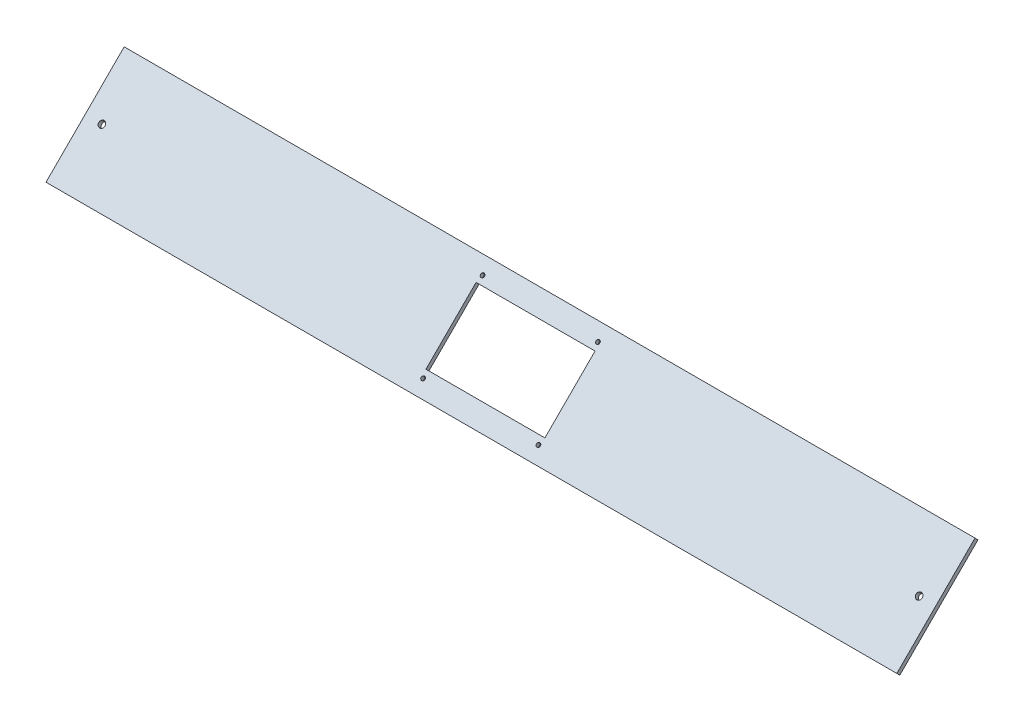
ISO-10303-21;
HEADER;
FILE_DESCRIPTION(('STEP AP214'),'2;1');
FILE_NAME('part.step','',(''),(''),'','','');
FILE_SCHEMA(('AUTOMOTIVE_DESIGN { 1 0 10303 214 1 1 1 1 }'));
ENDSEC;
DATA;
#1=APPLICATION_CONTEXT('core data for automotive mechanical design processes');
#2=APPLICATION_PROTOCOL_DEFINITION('international standard','automotive_design',2000,#1);
#3=PRODUCT_CONTEXT('',#1,'mechanical');
#4=PRODUCT('Part','Part','',(#3));
#5=PRODUCT_RELATED_PRODUCT_CATEGORY('part','',(#4));
#6=PRODUCT_DEFINITION_FORMATION('','',#4);
#7=PRODUCT_DEFINITION_CONTEXT('part definition',#1,'design');
#8=PRODUCT_DEFINITION('design','',#6,#7);
#9=PRODUCT_DEFINITION_SHAPE('','',#8);
#10=(LENGTH_UNIT() NAMED_UNIT(*) SI_UNIT(.MILLI.,.METRE.));
#11=(NAMED_UNIT(*) PLANE_ANGLE_UNIT() SI_UNIT($,.RADIAN.));
#12=(NAMED_UNIT(*) SI_UNIT($,.STERADIAN.) SOLID_ANGLE_UNIT());
#13=UNCERTAINTY_MEASURE_WITH_UNIT(LENGTH_MEASURE(1.E-05),#10,'distance_accuracy_value','');
#14=(GEOMETRIC_REPRESENTATION_CONTEXT(3) GLOBAL_UNCERTAINTY_ASSIGNED_CONTEXT((#13)) GLOBAL_UNIT_ASSIGNED_CONTEXT((#10,
#11,#12)) REPRESENTATION_CONTEXT('',''));
#15=CARTESIAN_POINT('',(0.,0.,0.));
#16=DIRECTION('',(0.,0.,1.));
#17=DIRECTION('',(1.,0.,0.));
#18=AXIS2_PLACEMENT_3D('',#15,#16,#17);
#19=CARTESIAN_POINT('',(306.,-385.882863738547,-560.380338421605));
#20=DIRECTION('',(0.,0.707106781186548,0.707106781186547));
#21=DIRECTION('',(0.,-0.707106781186547,0.707106781186548));
#22=AXIS2_PLACEMENT_3D('',#19,#20,#21);
#23=CYLINDRICAL_SURFACE('',#22,1.59999999999996);
#24=CARTESIAN_POINT('',(306.,112.248737341529,-62.2487373415291));
#25=DIRECTION('',(0.,0.707106781186549,0.707106781186546));
#26=DIRECTION('',(0.,-0.707106781186546,0.707106781186549));
#27=AXIS2_PLACEMENT_3D('',#24,#25,#26);
#28=CIRCLE('',#27,1.59999999999996);
#29=CARTESIAN_POINT('',(306.,111.117366491631,-61.1173664916306));
#30=VERTEX_POINT('',#29);
#31=EDGE_CURVE('E170',#30,#30,#28,.T.);
#32=CARTESIAN_POINT('',(306.,114.748737341529,-59.7487373415292));
#33=DIRECTION('',(0.,-0.707106781186548,-0.707106781186547));
#34=DIRECTION('',(0.,0.707106781186547,-0.707106781186548));
#35=AXIS2_PLACEMENT_3D('',#32,#33,#34);
#36=CIRCLE('',#35,1.59999999999996);
#37=CARTESIAN_POINT('',(306.,113.617366491631,-58.6173664916306));
#38=VERTEX_POINT('',#37);
#39=EDGE_CURVE('E207',#38,#38,#36,.T.);
#40=CARTESIAN_POINT('',(306.,111.117366491631,-61.1173664916306));
#41=CARTESIAN_POINT('',(306.,111.143408158297,-61.0913248249639));
#42=CARTESIAN_POINT('',(306.,111.169449824964,-61.0652831582973));
#43=CARTESIAN_POINT('',(306.,111.221533158297,-61.0131998249639));
#44=CARTESIAN_POINT('',(306.,111.247574824964,-60.9871581582973));
#45=CARTESIAN_POINT('',(306.,111.299658158297,-60.9350748249639));
#46=CARTESIAN_POINT('',(306.,111.325699824964,-60.9090331582973));
#47=CARTESIAN_POINT('',(306.,111.377783158297,-60.856949824964));
#48=CARTESIAN_POINT('',(306.,111.403824824964,-60.8309081582973));
#49=CARTESIAN_POINT('',(306.,111.455908158297,-60.778824824964));
#50=CARTESIAN_POINT('',(306.,111.481949824964,-60.7527831582973));
#51=CARTESIAN_POINT('',(306.,111.534033158297,-60.7006998249639));
#52=CARTESIAN_POINT('',(306.,111.560074824964,-60.6746581582973));
#53=CARTESIAN_POINT('',(306.,111.612158158297,-60.6225748249639));
#54=CARTESIAN_POINT('',(306.,111.638199824964,-60.5965331582973));
#55=CARTESIAN_POINT('',(306.,111.690283158297,-60.544449824964));
#56=CARTESIAN_POINT('',(306.,111.716324824964,-60.5184081582973));
#57=CARTESIAN_POINT('',(306.,111.768408158297,-60.466324824964));
#58=CARTESIAN_POINT('',(306.,111.794449824964,-60.4402831582973));
#59=CARTESIAN_POINT('',(306.,111.846533158297,-60.3881998249639));
#60=CARTESIAN_POINT('',(306.,111.872574824964,-60.3621581582973));
#61=CARTESIAN_POINT('',(306.,111.924658158297,-60.310074824964));
#62=CARTESIAN_POINT('',(306.,111.950699824964,-60.2840331582973));
#63=CARTESIAN_POINT('',(306.,112.002783158297,-60.2319498249639));
#64=CARTESIAN_POINT('',(306.,112.028824824964,-60.2059081582973));
#65=CARTESIAN_POINT('',(306.,112.080908158297,-60.1538248249639));
#66=CARTESIAN_POINT('',(306.,112.106949824964,-60.1277831582973));
#67=CARTESIAN_POINT('',(306.,112.159033158297,-60.0756998249639));
#68=CARTESIAN_POINT('',(306.,112.185074824964,-60.0496581582973));
#69=CARTESIAN_POINT('',(306.,112.237158158297,-59.997574824964));
#70=CARTESIAN_POINT('',(306.,112.263199824964,-59.9715331582973));
#71=CARTESIAN_POINT('',(306.,112.315283158297,-59.919449824964));
#72=CARTESIAN_POINT('',(306.,112.341324824964,-59.8934081582973));
#73=CARTESIAN_POINT('',(306.,112.393408158297,-59.841324824964));
#74=CARTESIAN_POINT('',(306.,112.419449824964,-59.8152831582973));
#75=CARTESIAN_POINT('',(306.,112.471533158297,-59.763199824964));
#76=CARTESIAN_POINT('',(306.,112.497574824964,-59.7371581582973));
#77=CARTESIAN_POINT('',(306.,112.549658158297,-59.685074824964));
#78=CARTESIAN_POINT('',(306.,112.575699824964,-59.6590331582973));
#79=CARTESIAN_POINT('',(306.,112.627783158297,-59.606949824964));
#80=CARTESIAN_POINT('',(306.,112.653824824964,-59.5809081582973));
#81=CARTESIAN_POINT('',(306.,112.705908158297,-59.528824824964));
#82=CARTESIAN_POINT('',(306.,112.731949824964,-59.5027831582973));
#83=CARTESIAN_POINT('',(306.,112.784033158297,-59.450699824964));
#84=CARTESIAN_POINT('',(306.,112.810074824964,-59.4246581582973));
#85=CARTESIAN_POINT('',(306.,112.862158158297,-59.372574824964));
#86=CARTESIAN_POINT('',(306.,112.888199824964,-59.3465331582973));
#87=CARTESIAN_POINT('',(306.,112.940283158297,-59.294449824964));
#88=CARTESIAN_POINT('',(306.,112.966324824964,-59.2684081582973));
#89=CARTESIAN_POINT('',(306.,113.018408158297,-59.216324824964));
#90=CARTESIAN_POINT('',(306.,113.044449824964,-59.1902831582973));
#91=CARTESIAN_POINT('',(306.,113.096533158297,-59.138199824964));
#92=CARTESIAN_POINT('',(306.,113.122574824964,-59.1121581582973));
#93=CARTESIAN_POINT('',(306.,113.174658158297,-59.060074824964));
#94=CARTESIAN_POINT('',(306.,113.200699824964,-59.0340331582974));
#95=CARTESIAN_POINT('',(306.,113.252783158297,-58.981949824964));
#96=CARTESIAN_POINT('',(306.,113.278824824964,-58.9559081582973));
#97=CARTESIAN_POINT('',(306.,113.330908158297,-58.9038248249639));
#98=CARTESIAN_POINT('',(306.,113.356949824964,-58.8777831582973));
#99=CARTESIAN_POINT('',(306.,113.409033158297,-58.825699824964));
#100=CARTESIAN_POINT('',(306.,113.435074824964,-58.7996581582973));
#101=CARTESIAN_POINT('',(306.,113.487158158297,-58.7475748249639));
#102=CARTESIAN_POINT('',(306.,113.513199824964,-58.7215331582973));
#103=CARTESIAN_POINT('',(306.,113.565283158297,-58.669449824964));
#104=CARTESIAN_POINT('',(306.,113.591324824964,-58.6434081582974));
#105=CARTESIAN_POINT('',(306.,113.617366491631,-58.6173664916306));
#106=B_SPLINE_CURVE_WITH_KNOTS('',3,(#40,#41,#42,#43,#44,#45,#46,#47,#48,#49,#50,#51,#52,#53,
#54,#55,#56,#57,#58,#59,#60,#61,#62,#63,#64,#65,#66,#67,#68,#69,#70,#71,#72,#73,#74,#75,#76,#77,
#78,#79,#80,#81,#82,#83,#84,#85,#86,#87,#88,#89,#90,#91,#92,#93,#94,#95,#96,#97,#98,#99,#100,
#101,#102,#103,#104,#105),.UNSPECIFIED.,.F.,.F.,(4,2,2,2,2,2,2,2,2,2,2,2,2,2,2,2,2,2,2,2,2,2,2,
2,2,2,2,2,2,2,2,2,4),(0.,0.110485434560376,0.220970869120752,0.331456303681168,
0.441941738241544,0.552427172801998,0.662912607362374,0.77339804192275,0.883883476483126,
0.994368911043542,1.10485434560392,1.21533978016429,1.32582521472479,1.43631064928516,
1.54679608384554,1.65728151840592,1.76776695296629,1.87825238752667,1.98873782208708,
2.09922325664746,2.20970869120783,2.32019412576833,2.4306795603287,2.54116499488908,
2.6516504294495,2.76213586400987,2.87262129857025,2.98310673313062,3.09359216769116,
3.20407760225145,3.31456303681191,3.42504847137229,3.53553390593266),.UNSPECIFIED.);
#107=EDGE_CURVE('BSEAM41',#30,#38,#106,.T.);
#108=ORIENTED_EDGE('',*,*,#31,.F.);
#109=ORIENTED_EDGE('',*,*,#39,.F.);
#110=ORIENTED_EDGE('',*,*,#107,.T.);
#111=ORIENTED_EDGE('',*,*,#107,.F.);
#112=EDGE_LOOP('',(#108,#110,#109,#111));
#113=FACE_BOUND('',#112,.T.);
#114=ADVANCED_FACE('F41',(#113),#23,.F.);
#115=CARTESIAN_POINT('',(306.,-435.380338421605,-510.882863738546));
#116=DIRECTION('',(0.,0.707106781186548,0.707106781186547));
#117=DIRECTION('',(0.,-0.707106781186547,0.707106781186548));
#118=AXIS2_PLACEMENT_3D('',#115,#116,#117);
#119=CYLINDRICAL_SURFACE('',#118,1.59999999999996);
#120=CARTESIAN_POINT('',(306.,65.2512626584708,-10.2512626584708));
#121=DIRECTION('',(0.,0.707106781186548,0.707106781186547));
#122=DIRECTION('',(0.,-0.707106781186547,0.707106781186548));
#123=AXIS2_PLACEMENT_3D('',#120,#121,#122);
#124=CIRCLE('',#123,1.59999999999996);
#125=CARTESIAN_POINT('',(306.,64.1198918085724,-9.11989180857231));
#126=VERTEX_POINT('',#125);
#127=EDGE_CURVE('E179',#126,#126,#124,.T.);
#128=ORIENTED_EDGE('',*,*,#127,.T.);
#129=EDGE_LOOP('',(#128));
#130=FACE_BOUND('',#129,.T.);
#131=CARTESIAN_POINT('',(306.,62.7512626584708,-12.7512626584707));
#132=DIRECTION('',(0.,0.707106781186549,0.707106781186546));
#133=DIRECTION('',(0.,-0.707106781186546,0.707106781186549));
#134=AXIS2_PLACEMENT_3D('',#131,#132,#133);
#135=CIRCLE('',#134,1.59999999999996);
#136=CARTESIAN_POINT('',(306.,61.6198918085723,-11.6198918085723));
#137=VERTEX_POINT('',#136);
#138=EDGE_CURVE('E167',#137,#137,#135,.T.);
#139=ORIENTED_EDGE('',*,*,#138,.F.);
#140=EDGE_LOOP('',(#139));
#141=FACE_BOUND('',#140,.T.);
#142=ADVANCED_FACE('F214',(#130,#141),#119,.F.);
#143=CARTESIAN_POINT('',(304.5,-389.771951035073,-556.491251125079));
#144=DIRECTION('',(0.,-0.707106781186547,0.707106781186548));
#145=DIRECTION('',(0.,-0.707106781186548,-0.707106781186547));
#146=AXIS2_PLACEMENT_3D('',#143,#144,#145);
#147=PLANE('',#146);
#148=DIRECTION('',(1.,0.,0.));
#149=VECTOR('',#148,1.);
#150=CARTESIAN_POINT('',(708.,108.359650045003,-58.3596500450031));
#151=LINE('',#150,#149);
#152=CARTESIAN_POINT('',(304.5,108.359650045003,-58.3596500450033));
#153=VERTEX_POINT('',#152);
#154=CARTESIAN_POINT('',(403.5,108.359650045003,-58.3596500450031));
#155=VERTEX_POINT('',#154);
#156=EDGE_CURVE('E162',#153,#155,#151,.T.);
#157=ORIENTED_EDGE('',*,*,#156,.T.);
#158=DIRECTION('',(0.,0.707106781186548,0.707106781186547));
#159=VECTOR('',#158,1.);
#160=CARTESIAN_POINT('',(403.5,-389.771951035073,-556.491251125079));
#161=LINE('',#160,#159);
#162=CARTESIAN_POINT('',(403.5,110.859650045003,-55.8596500450031));
#163=VERTEX_POINT('',#162);
#164=EDGE_CURVE('E194',#155,#163,#161,.T.);
#165=ORIENTED_EDGE('',*,*,#164,.T.);
#166=DIRECTION('',(1.,0.,0.));
#167=VECTOR('',#166,1.);
#168=CARTESIAN_POINT('',(304.5,110.859650045003,-55.8596500450031));
#169=LINE('',#168,#167);
#170=CARTESIAN_POINT('',(304.5,110.859650045003,-55.8596500450031));
#171=VERTEX_POINT('',#170);
#172=EDGE_CURVE('E187',#171,#163,#169,.T.);
#173=ORIENTED_EDGE('',*,*,#172,.F.);
#174=DIRECTION('',(0.,0.707106781186548,0.707106781186547));
#175=VECTOR('',#174,1.);
#176=CARTESIAN_POINT('',(304.5,-389.771951035073,-556.491251125079));
#177=LINE('',#176,#175);
#178=EDGE_CURVE('E50',#153,#171,#177,.T.);
#179=ORIENTED_EDGE('',*,*,#178,.F.);
#180=EDGE_LOOP('',(#157,#165,#173,#179));
#181=FACE_BOUND('',#180,.T.);
#182=ADVANCED_FACE('F220',(#181),#147,.T.);
#183=CARTESIAN_POINT('',(304.5,-389.771951035073,-556.491251125079));
#184=DIRECTION('',(-1.,0.,0.));
#185=DIRECTION('',(0.,0.,1.));
#186=AXIS2_PLACEMENT_3D('',#183,#184,#185);
#187=PLANE('',#186);
#188=ORIENTED_EDGE('',*,*,#178,.T.);
#189=DIRECTION('',(0.,-0.707106781186547,0.707106781186548));
#190=VECTOR('',#189,1.);
#191=CARTESIAN_POINT('',(304.5,110.859650045003,-55.8596500450031));
#192=LINE('',#191,#190);
#193=CARTESIAN_POINT('',(304.5,69.1403499549969,-14.1403499549968));
#194=VERTEX_POINT('',#193);
#195=EDGE_CURVE('E190',#171,#194,#192,.T.);
#196=ORIENTED_EDGE('',*,*,#195,.T.);
#197=DIRECTION('',(0.,0.707106781186548,0.707106781186547));
#198=VECTOR('',#197,1.);
#199=CARTESIAN_POINT('',(304.5,-431.491251125079,-514.771951035072));
#200=LINE('',#199,#198);
#201=CARTESIAN_POINT('',(304.5,66.6403499549968,-16.6403499549968));
#202=VERTEX_POINT('',#201);
#203=EDGE_CURVE('E11',#202,#194,#200,.T.);
#204=ORIENTED_EDGE('',*,*,#203,.F.);
#205=DIRECTION('',(0.,-0.707106781186546,0.707106781186549));
#206=VECTOR('',#205,1.);
#207=CARTESIAN_POINT('',(304.5,120.,-70.));
#208=LINE('',#207,#206);
#209=EDGE_CURVE('E159',#153,#202,#208,.T.);
#210=ORIENTED_EDGE('',*,*,#209,.F.);
#211=EDGE_LOOP('',(#188,#196,#204,#210));
#212=FACE_BOUND('',#211,.T.);
#213=ADVANCED_FACE('F236',(#212),#187,.F.);
#214=CARTESIAN_POINT('',(304.5,-431.491251125079,-514.771951035072));
#215=DIRECTION('',(0.,-0.707106781186547,0.707106781186548));
#216=DIRECTION('',(0.,-0.707106781186548,-0.707106781186547));
#217=AXIS2_PLACEMENT_3D('',#214,#215,#216);
#218=PLANE('',#217);
#219=ORIENTED_EDGE('',*,*,#203,.T.);
#220=DIRECTION('',(1.,0.,0.));
#221=VECTOR('',#220,1.);
#222=CARTESIAN_POINT('',(304.5,69.1403499549969,-14.1403499549968));
#223=LINE('',#222,#221);
#224=CARTESIAN_POINT('',(403.5,69.1403499549968,-14.1403499549968));
#225=VERTEX_POINT('',#224);
#226=EDGE_CURVE('E182',#194,#225,#223,.T.);
#227=ORIENTED_EDGE('',*,*,#226,.T.);
#228=DIRECTION('',(0.,0.707106781186548,0.707106781186547));
#229=VECTOR('',#228,1.);
#230=CARTESIAN_POINT('',(403.5,-431.491251125079,-514.771951035072));
#231=LINE('',#230,#229);
#232=CARTESIAN_POINT('',(403.5,66.6403499549968,-16.6403499549968));
#233=VERTEX_POINT('',#232);
#234=EDGE_CURVE('E191',#233,#225,#231,.T.);
#235=ORIENTED_EDGE('',*,*,#234,.F.);
#236=DIRECTION('',(1.,0.,0.));
#237=VECTOR('',#236,1.);
#238=CARTESIAN_POINT('',(708.,66.6403499549968,-16.6403499549968));
#239=LINE('',#238,#237);
#240=EDGE_CURVE('E156',#202,#233,#239,.T.);
#241=ORIENTED_EDGE('',*,*,#240,.F.);
#242=EDGE_LOOP('',(#219,#227,#235,#241));
#243=FACE_BOUND('',#242,.T.);
#244=ADVANCED_FACE('F239',(#243),#218,.F.);
#245=CARTESIAN_POINT('',(403.5,-389.771951035073,-556.491251125079));
#246=DIRECTION('',(-1.,0.,0.));
#247=DIRECTION('',(0.,0.,1.));
#248=AXIS2_PLACEMENT_3D('',#245,#246,#247);
#249=PLANE('',#248);
#250=DIRECTION('',(0.,-0.707106781186546,0.707106781186549));
#251=VECTOR('',#250,1.);
#252=CARTESIAN_POINT('',(403.5,120.,-70.));
#253=LINE('',#252,#251);
#254=EDGE_CURVE('E165',#155,#233,#253,.T.);
#255=ORIENTED_EDGE('',*,*,#254,.T.);
#256=ORIENTED_EDGE('',*,*,#234,.T.);
#257=DIRECTION('',(0.,-0.707106781186547,0.707106781186548));
#258=VECTOR('',#257,1.);
#259=CARTESIAN_POINT('',(403.5,110.859650045003,-55.8596500450031));
#260=LINE('',#259,#258);
#261=EDGE_CURVE('E184',#163,#225,#260,.T.);
#262=ORIENTED_EDGE('',*,*,#261,.F.);
#263=ORIENTED_EDGE('',*,*,#164,.F.);
#264=EDGE_LOOP('',(#255,#256,#262,#263));
#265=FACE_BOUND('',#264,.T.);
#266=ADVANCED_FACE('F231',(#265),#249,.T.);
#267=CARTESIAN_POINT('',(402.,-385.882863738547,-560.380338421605));
#268=DIRECTION('',(0.,0.707106781186548,0.707106781186547));
#269=DIRECTION('',(0.,-0.707106781186547,0.707106781186548));
#270=AXIS2_PLACEMENT_3D('',#267,#268,#269);
#271=CYLINDRICAL_SURFACE('',#270,1.59999999999996);
#272=CARTESIAN_POINT('',(402.,114.748737341529,-59.7487373415291));
#273=DIRECTION('',(0.,0.707106781186548,0.707106781186547));
#274=DIRECTION('',(0.,-0.707106781186547,0.707106781186548));
#275=AXIS2_PLACEMENT_3D('',#272,#273,#274);
#276=CIRCLE('',#275,1.59999999999996);
#277=CARTESIAN_POINT('',(402.,113.617366491631,-58.6173664916307));
#278=VERTEX_POINT('',#277);
#279=EDGE_CURVE('E173',#278,#278,#276,.T.);
#280=ORIENTED_EDGE('',*,*,#279,.T.);
#281=EDGE_LOOP('',(#280));
#282=FACE_BOUND('',#281,.T.);
#283=CARTESIAN_POINT('',(402.,112.248737341529,-62.2487373415291));
#284=DIRECTION('',(0.,0.707106781186549,0.707106781186546));
#285=DIRECTION('',(0.,-0.707106781186546,0.707106781186549));
#286=AXIS2_PLACEMENT_3D('',#283,#284,#285);
#287=CIRCLE('',#286,1.59999999999996);
#288=CARTESIAN_POINT('',(402.,111.117366491631,-61.1173664916307));
#289=VERTEX_POINT('',#288);
#290=EDGE_CURVE('E153',#289,#289,#287,.T.);
#291=ORIENTED_EDGE('',*,*,#290,.F.);
#292=EDGE_LOOP('',(#291));
#293=FACE_BOUND('',#292,.T.);
#294=ADVANCED_FACE('F227',(#282,#293),#271,.F.);
#295=CARTESIAN_POINT('',(402.,-435.380338421605,-510.882863738546));
#296=DIRECTION('',(0.,0.707106781186548,0.707106781186547));
#297=DIRECTION('',(0.,-0.707106781186547,0.707106781186548));
#298=AXIS2_PLACEMENT_3D('',#295,#296,#297);
#299=CYLINDRICAL_SURFACE('',#298,1.59999999999997);
#300=CARTESIAN_POINT('',(402.,65.2512626584708,-10.2512626584708));
#301=DIRECTION('',(0.,0.707106781186548,0.707106781186547));
#302=DIRECTION('',(0.,-0.707106781186547,0.707106781186548));
#303=AXIS2_PLACEMENT_3D('',#300,#301,#302);
#304=CIRCLE('',#303,1.59999999999997);
#305=CARTESIAN_POINT('',(402.,64.1198918085724,-9.11989180857232));
#306=VERTEX_POINT('',#305);
#307=EDGE_CURVE('E176',#306,#306,#304,.T.);
#308=ORIENTED_EDGE('',*,*,#307,.T.);
#309=EDGE_LOOP('',(#308));
#310=FACE_BOUND('',#309,.T.);
#311=CARTESIAN_POINT('',(402.,62.7512626584708,-12.7512626584707));
#312=DIRECTION('',(0.,0.707106781186549,0.707106781186546));
#313=DIRECTION('',(0.,-0.707106781186546,0.707106781186549));
#314=AXIS2_PLACEMENT_3D('',#311,#312,#313);
#315=CIRCLE('',#314,1.59999999999997);
#316=CARTESIAN_POINT('',(402.,61.6198918085723,-11.6198918085723));
#317=VERTEX_POINT('',#316);
#318=EDGE_CURVE('E148',#317,#317,#315,.T.);
#319=ORIENTED_EDGE('',*,*,#318,.F.);
#320=EDGE_LOOP('',(#319));
#321=FACE_BOUND('',#320,.T.);
#322=ADVANCED_FACE('F230',(#310,#321),#299,.F.);
#323=CARTESIAN_POINT('',(708.,55.,0.));
#324=DIRECTION('',(0.,-0.707106781186548,-0.707106781186547));
#325=DIRECTION('',(0.,0.707106781186547,-0.707106781186548));
#326=AXIS2_PLACEMENT_3D('',#323,#324,#325);
#327=PLANE('',#326);
#328=ORIENTED_EDGE('',*,*,#279,.F.);
#329=EDGE_LOOP('',(#328));
#330=FACE_BOUND('',#329,.T.);
#331=ORIENTED_EDGE('',*,*,#127,.F.);
#332=EDGE_LOOP('',(#331));
#333=FACE_BOUND('',#332,.T.);
#334=DIRECTION('',(0.,-0.707106781186547,0.707106781186548));
#335=VECTOR('',#334,1.);
#336=CARTESIAN_POINT('',(708.,55.,0.));
#337=LINE('',#336,#335);
#338=CARTESIAN_POINT('',(708.,122.528284271247,-67.5282842712474));
#339=VERTEX_POINT('',#338);
#340=CARTESIAN_POINT('',(708.,57.4744604020851,-2.47446040208497));
#341=VERTEX_POINT('',#340);
#342=EDGE_CURVE('E140',#339,#341,#337,.T.);
#343=ORIENTED_EDGE('',*,*,#342,.F.);
#344=DIRECTION('',(-1.,0.,0.));
#345=VECTOR('',#344,1.);
#346=CARTESIAN_POINT('',(0.,122.528284271247,-67.5282842712473));
#347=LINE('',#346,#345);
#348=CARTESIAN_POINT('',(0.,122.528284271247,-67.5282842712473));
#349=VERTEX_POINT('',#348);
#350=EDGE_CURVE('E112',#339,#349,#347,.T.);
#351=ORIENTED_EDGE('',*,*,#350,.T.);
#352=DIRECTION('',(0.,-0.707106781186547,0.707106781186548));
#353=VECTOR('',#352,1.);
#354=CARTESIAN_POINT('',(0.,55.,0.));
#355=LINE('',#354,#353);
#356=CARTESIAN_POINT('',(0.,57.474460402085,-2.47446040208497));
#357=VERTEX_POINT('',#356);
#358=EDGE_CURVE('E105',#349,#357,#355,.T.);
#359=ORIENTED_EDGE('',*,*,#358,.T.);
#360=DIRECTION('',(-1.,0.,0.));
#361=VECTOR('',#360,1.);
#362=CARTESIAN_POINT('',(0.,57.474460402085,-2.47446040208497));
#363=LINE('',#362,#361);
#364=EDGE_CURVE('E110',#341,#357,#363,.T.);
#365=ORIENTED_EDGE('',*,*,#364,.F.);
#366=EDGE_LOOP('',(#343,#351,#359,#365));
#367=FACE_BOUND('',#366,.T.);
#368=ORIENTED_EDGE('',*,*,#261,.T.);
#369=ORIENTED_EDGE('',*,*,#226,.F.);
#370=ORIENTED_EDGE('',*,*,#195,.F.);
#371=ORIENTED_EDGE('',*,*,#172,.T.);
#372=EDGE_LOOP('',(#368,#369,#370,#371));
#373=FACE_BOUND('',#372,.T.);
#374=CARTESIAN_POINT('',(694.,90.0013723366661,-35.0013723366662));
#375=DIRECTION('',(0.,0.707106781186548,0.707106781186547));
#376=DIRECTION('',(0.,-0.707106781186547,0.707106781186548));
#377=AXIS2_PLACEMENT_3D('',#374,#375,#376);
#378=CIRCLE('',#377,2.60000000000007);
#379=CARTESIAN_POINT('',(694.,88.1628947055811,-33.1628947055811));
#380=VERTEX_POINT('',#379);
#381=EDGE_CURVE('E202',#380,#380,#378,.T.);
#382=ORIENTED_EDGE('',*,*,#381,.F.);
#383=EDGE_LOOP('',(#382));
#384=FACE_BOUND('',#383,.T.);
#385=CARTESIAN_POINT('',(14.,90.0013723366661,-35.0013723366662));
#386=DIRECTION('',(0.,0.707106781186548,0.707106781186547));
#387=DIRECTION('',(0.,-0.707106781186547,0.707106781186548));
#388=AXIS2_PLACEMENT_3D('',#385,#386,#387);
#389=CIRCLE('',#388,2.6);
#390=CARTESIAN_POINT('',(14.,88.1628947055811,-33.1628947055812));
#391=VERTEX_POINT('',#390);
#392=EDGE_CURVE('E198',#391,#391,#389,.T.);
#393=ORIENTED_EDGE('',*,*,#392,.F.);
#394=EDGE_LOOP('',(#393));
#395=FACE_BOUND('',#394,.T.);
#396=ORIENTED_EDGE('',*,*,#307,.F.);
#397=EDGE_LOOP('',(#396));
#398=FACE_BOUND('',#397,.T.);
#399=ORIENTED_EDGE('',*,*,#39,.T.);
#400=EDGE_LOOP('',(#399));
#401=FACE_BOUND('',#400,.T.);
#402=ADVANCED_FACE('F107',(#330,#333,#367,#373,#384,#395,#398,#401),#327,.F.);
#403=CARTESIAN_POINT('',(708.,120.,-70.));
#404=DIRECTION('',(0.,0.707106781186549,0.707106781186546));
#405=DIRECTION('',(0.,-0.707106781186546,0.707106781186549));
#406=AXIS2_PLACEMENT_3D('',#403,#404,#405);
#407=PLANE('',#406);
#408=CARTESIAN_POINT('',(14.,87.5013723366661,-37.5013723366662));
#409=DIRECTION('',(0.,0.707106781186549,0.707106781186546));
#410=DIRECTION('',(0.,-0.707106781186546,0.707106781186549));
#411=AXIS2_PLACEMENT_3D('',#408,#409,#410);
#412=CIRCLE('',#411,2.6);
#413=CARTESIAN_POINT('',(14.,85.6628947055811,-35.6628947055812));
#414=VERTEX_POINT('',#413);
#415=EDGE_CURVE('E45',#414,#414,#412,.T.);
#416=ORIENTED_EDGE('',*,*,#415,.T.);
#417=EDGE_LOOP('',(#416));
#418=FACE_BOUND('',#417,.T.);
#419=CARTESIAN_POINT('',(694.,87.5013723366661,-37.5013723366662));
#420=DIRECTION('',(0.,0.707106781186549,0.707106781186546));
#421=DIRECTION('',(0.,-0.707106781186546,0.707106781186549));
#422=AXIS2_PLACEMENT_3D('',#419,#420,#421);
#423=CIRCLE('',#422,2.60000000000007);
#424=CARTESIAN_POINT('',(694.,85.662894705581,-35.6628947055811));
#425=VERTEX_POINT('',#424);
#426=EDGE_CURVE('E131',#425,#425,#423,.T.);
#427=ORIENTED_EDGE('',*,*,#426,.T.);
#428=EDGE_LOOP('',(#427));
#429=FACE_BOUND('',#428,.T.);
#430=ORIENTED_EDGE('',*,*,#318,.T.);
#431=EDGE_LOOP('',(#430));
#432=FACE_BOUND('',#431,.T.);
#433=ORIENTED_EDGE('',*,*,#290,.T.);
#434=EDGE_LOOP('',(#433));
#435=FACE_BOUND('',#434,.T.);
#436=ORIENTED_EDGE('',*,*,#209,.T.);
#437=ORIENTED_EDGE('',*,*,#240,.T.);
#438=ORIENTED_EDGE('',*,*,#254,.F.);
#439=ORIENTED_EDGE('',*,*,#156,.F.);
#440=EDGE_LOOP('',(#436,#437,#438,#439));
#441=FACE_BOUND('',#440,.T.);
#442=ORIENTED_EDGE('',*,*,#138,.T.);
#443=EDGE_LOOP('',(#442));
#444=FACE_BOUND('',#443,.T.);
#445=ORIENTED_EDGE('',*,*,#31,.T.);
#446=EDGE_LOOP('',(#445));
#447=FACE_BOUND('',#446,.T.);
#448=DIRECTION('',(0.,0.707106781186546,-0.707106781186548));
#449=VECTOR('',#448,1.);
#450=CARTESIAN_POINT('',(0.,120.,-70.));
#451=LINE('',#450,#449);
#452=CARTESIAN_POINT('',(0.,54.9744604020851,-4.97446040208505));
#453=VERTEX_POINT('',#452);
#454=CARTESIAN_POINT('',(0.,120.028284271247,-70.0282842712474));
#455=VERTEX_POINT('',#454);
#456=EDGE_CURVE('E116',#453,#455,#451,.T.);
#457=ORIENTED_EDGE('',*,*,#456,.T.);
#458=DIRECTION('',(1.,0.,0.));
#459=VECTOR('',#458,1.);
#460=CARTESIAN_POINT('',(0.,120.028284271247,-70.0282842712474));
#461=LINE('',#460,#459);
#462=CARTESIAN_POINT('',(708.,120.028284271247,-70.0282842712474));
#463=VERTEX_POINT('',#462);
#464=EDGE_CURVE('E137',#455,#463,#461,.T.);
#465=ORIENTED_EDGE('',*,*,#464,.T.);
#466=DIRECTION('',(0.,0.707106781186546,-0.707106781186548));
#467=VECTOR('',#466,1.);
#468=CARTESIAN_POINT('',(708.,120.,-70.));
#469=LINE('',#468,#467);
#470=CARTESIAN_POINT('',(708.,54.9744604020851,-4.9744604020851));
#471=VERTEX_POINT('',#470);
#472=EDGE_CURVE('E117',#471,#463,#469,.T.);
#473=ORIENTED_EDGE('',*,*,#472,.F.);
#474=DIRECTION('',(1.,0.,0.));
#475=VECTOR('',#474,1.);
#476=CARTESIAN_POINT('',(0.,54.9744604020851,-4.97446040208505));
#477=LINE('',#476,#475);
#478=EDGE_CURVE('E134',#453,#471,#477,.T.);
#479=ORIENTED_EDGE('',*,*,#478,.F.);
#480=EDGE_LOOP('',(#457,#465,#473,#479));
#481=FACE_BOUND('',#480,.T.);
#482=ADVANCED_FACE('F257',(#418,#429,#432,#435,#441,#444,#447,#481),#407,.F.);
#483=CARTESIAN_POINT('',(0.,0.,0.));
#484=DIRECTION('',(-1.,0.,0.));
#485=DIRECTION('',(0.,0.,1.));
#486=AXIS2_PLACEMENT_3D('',#483,#484,#485);
#487=PLANE('',#486);
#488=ORIENTED_EDGE('',*,*,#358,.F.);
#489=DIRECTION('',(0.,0.707106781186548,0.707106781186547));
#490=VECTOR('',#489,1.);
#491=CARTESIAN_POINT('',(0.,-380.60331760782,-570.659886150313));
#492=LINE('',#491,#490);
#493=EDGE_CURVE('E141',#455,#349,#492,.T.);
#494=ORIENTED_EDGE('',*,*,#493,.F.);
#495=ORIENTED_EDGE('',*,*,#456,.F.);
#496=DIRECTION('',(0.,0.707106781186548,0.707106781186547));
#497=VECTOR('',#496,1.);
#498=CARTESIAN_POINT('',(0.,-445.657141476982,-505.606062281151));
#499=LINE('',#498,#497);
#500=EDGE_CURVE('E120',#453,#357,#499,.T.);
#501=ORIENTED_EDGE('',*,*,#500,.T.);
#502=EDGE_LOOP('',(#488,#494,#495,#501));
#503=FACE_BOUND('',#502,.T.);
#504=ADVANCED_FACE('F43',(#503),#487,.T.);
#505=CARTESIAN_POINT('',(708.,0.,0.));
#506=DIRECTION('',(-1.,0.,0.));
#507=DIRECTION('',(0.,0.,1.));
#508=AXIS2_PLACEMENT_3D('',#505,#506,#507);
#509=PLANE('',#508);
#510=ORIENTED_EDGE('',*,*,#472,.T.);
#511=DIRECTION('',(0.,0.707106781186548,0.707106781186547));
#512=VECTOR('',#511,1.);
#513=CARTESIAN_POINT('',(708.,-380.60331760782,-570.659886150313));
#514=LINE('',#513,#512);
#515=EDGE_CURVE('E143',#463,#339,#514,.T.);
#516=ORIENTED_EDGE('',*,*,#515,.T.);
#517=ORIENTED_EDGE('',*,*,#342,.T.);
#518=DIRECTION('',(0.,0.707106781186548,0.707106781186547));
#519=VECTOR('',#518,1.);
#520=CARTESIAN_POINT('',(708.,-445.657141476982,-505.606062281151));
#521=LINE('',#520,#519);
#522=EDGE_CURVE('E124',#471,#341,#521,.T.);
#523=ORIENTED_EDGE('',*,*,#522,.F.);
#524=EDGE_LOOP('',(#510,#516,#517,#523));
#525=FACE_BOUND('',#524,.T.);
#526=ADVANCED_FACE('F247',(#525),#509,.F.);
#527=CARTESIAN_POINT('',(0.,-380.60331760782,-570.659886150313));
#528=DIRECTION('',(0.,0.707106781186547,-0.707106781186548));
#529=DIRECTION('',(0.,0.707106781186548,0.707106781186547));
#530=AXIS2_PLACEMENT_3D('',#527,#528,#529);
#531=PLANE('',#530);
#532=ORIENTED_EDGE('',*,*,#464,.F.);
#533=ORIENTED_EDGE('',*,*,#493,.T.);
#534=ORIENTED_EDGE('',*,*,#350,.F.);
#535=ORIENTED_EDGE('',*,*,#515,.F.);
#536=EDGE_LOOP('',(#532,#533,#534,#535));
#537=FACE_BOUND('',#536,.T.);
#538=ADVANCED_FACE('F249',(#537),#531,.T.);
#539=CARTESIAN_POINT('',(0.,-445.657141476982,-505.606062281151));
#540=DIRECTION('',(0.,0.707106781186547,-0.707106781186548));
#541=DIRECTION('',(0.,0.707106781186548,0.707106781186547));
#542=AXIS2_PLACEMENT_3D('',#539,#540,#541);
#543=PLANE('',#542);
#544=ORIENTED_EDGE('',*,*,#500,.F.);
#545=ORIENTED_EDGE('',*,*,#478,.T.);
#546=ORIENTED_EDGE('',*,*,#522,.T.);
#547=ORIENTED_EDGE('',*,*,#364,.T.);
#548=EDGE_LOOP('',(#544,#545,#546,#547));
#549=FACE_BOUND('',#548,.T.);
#550=ADVANCED_FACE('F127',(#549),#543,.F.);
#551=CARTESIAN_POINT('',(694.,54.974460402085,-70.0282842712473));
#552=DIRECTION('',(0.,0.707106781186548,0.707106781186547));
#553=DIRECTION('',(0.,-0.707106781186547,0.707106781186548));
#554=AXIS2_PLACEMENT_3D('',#551,#552,#553);
#555=CYLINDRICAL_SURFACE('',#554,2.60000000000007);
#556=CARTESIAN_POINT('',(694.,88.1628947055811,-33.1628947055811));
#557=CARTESIAN_POINT('',(694.,88.1368530389144,-33.1889363722478));
#558=CARTESIAN_POINT('',(694.,88.1108113722477,-33.2149780389144));
#559=CARTESIAN_POINT('',(694.,88.0587280389144,-33.2670613722478));
#560=CARTESIAN_POINT('',(694.,88.0326863722477,-33.2931030389144));
#561=CARTESIAN_POINT('',(694.,87.9806030389144,-33.3451863722478));
#562=CARTESIAN_POINT('',(694.,87.9545613722477,-33.3712280389144));
#563=CARTESIAN_POINT('',(694.,87.9024780389144,-33.4233113722478));
#564=CARTESIAN_POINT('',(694.,87.8764363722477,-33.4493530389145));
#565=CARTESIAN_POINT('',(694.,87.8243530389144,-33.5014363722478));
#566=CARTESIAN_POINT('',(694.,87.7983113722477,-33.5274780389144));
#567=CARTESIAN_POINT('',(694.,87.7462280389144,-33.5795613722478));
#568=CARTESIAN_POINT('',(694.,87.7201863722477,-33.6056030389144));
#569=CARTESIAN_POINT('',(694.,87.6681030389144,-33.6576863722478));
#570=CARTESIAN_POINT('',(694.,87.6420613722477,-33.6837280389144));
#571=CARTESIAN_POINT('',(694.,87.5899780389144,-33.7358113722478));
#572=CARTESIAN_POINT('',(694.,87.5639363722477,-33.7618530389145));
#573=CARTESIAN_POINT('',(694.,87.5118530389144,-33.8139363722478));
#574=CARTESIAN_POINT('',(694.,87.4858113722477,-33.8399780389144));
#575=CARTESIAN_POINT('',(694.,87.4337280389144,-33.8920613722478));
#576=CARTESIAN_POINT('',(694.,87.4076863722477,-33.9181030389145));
#577=CARTESIAN_POINT('',(694.,87.3556030389144,-33.9701863722478));
#578=CARTESIAN_POINT('',(694.,87.3295613722477,-33.9962280389145));
#579=CARTESIAN_POINT('',(694.,87.2774780389144,-34.0483113722478));
#580=CARTESIAN_POINT('',(694.,87.2514363722477,-34.0743530389145));
#581=CARTESIAN_POINT('',(694.,87.1993530389144,-34.1264363722478));
#582=CARTESIAN_POINT('',(694.,87.1733113722477,-34.1524780389145));
#583=CARTESIAN_POINT('',(694.,87.1212280389144,-34.2045613722478));
#584=CARTESIAN_POINT('',(694.,87.0951863722477,-34.2306030389144));
#585=CARTESIAN_POINT('',(694.,87.0431030389144,-34.2826863722478));
#586=CARTESIAN_POINT('',(694.,87.0170613722477,-34.3087280389145));
#587=CARTESIAN_POINT('',(694.,86.9649780389144,-34.3608113722478));
#588=CARTESIAN_POINT('',(694.,86.9389363722477,-34.3868530389145));
#589=CARTESIAN_POINT('',(694.,86.8868530389144,-34.4389363722478));
#590=CARTESIAN_POINT('',(694.,86.8608113722477,-34.4649780389144));
#591=CARTESIAN_POINT('',(694.,86.8087280389144,-34.5170613722478));
#592=CARTESIAN_POINT('',(694.,86.7826863722477,-34.5431030389145));
#593=CARTESIAN_POINT('',(694.,86.7306030389144,-34.5951863722478));
#594=CARTESIAN_POINT('',(694.,86.7045613722477,-34.6212280389145));
#595=CARTESIAN_POINT('',(694.,86.6524780389144,-34.6733113722478));
#596=CARTESIAN_POINT('',(694.,86.6264363722477,-34.6993530389145));
#597=CARTESIAN_POINT('',(694.,86.5743530389144,-34.7514363722478));
#598=CARTESIAN_POINT('',(694.,86.5483113722477,-34.7774780389145));
#599=CARTESIAN_POINT('',(694.,86.4962280389144,-34.8295613722478));
#600=CARTESIAN_POINT('',(694.,86.4701863722477,-34.8556030389145));
#601=CARTESIAN_POINT('',(694.,86.4181030389144,-34.9076863722478));
#602=CARTESIAN_POINT('',(694.,86.3920613722477,-34.9337280389145));
#603=CARTESIAN_POINT('',(694.,86.3399780389144,-34.9858113722478));
#604=CARTESIAN_POINT('',(694.,86.3139363722477,-35.0118530389145));
#605=CARTESIAN_POINT('',(694.,86.2618530389144,-35.0639363722478));
#606=CARTESIAN_POINT('',(694.,86.2358113722477,-35.0899780389145));
#607=CARTESIAN_POINT('',(694.,86.1837280389144,-35.1420613722478));
#608=CARTESIAN_POINT('',(694.,86.1576863722477,-35.1681030389145));
#609=CARTESIAN_POINT('',(694.,86.1056030389144,-35.2201863722478));
#610=CARTESIAN_POINT('',(694.,86.0795613722477,-35.2462280389145));
#611=CARTESIAN_POINT('',(694.,86.0274780389144,-35.2983113722478));
#612=CARTESIAN_POINT('',(694.,86.0014363722477,-35.3243530389145));
#613=CARTESIAN_POINT('',(694.,85.9493530389144,-35.3764363722478));
#614=CARTESIAN_POINT('',(694.,85.9233113722477,-35.4024780389145));
#615=CARTESIAN_POINT('',(694.,85.8712280389144,-35.4545613722478));
#616=CARTESIAN_POINT('',(694.,85.8451863722477,-35.4806030389145));
#617=CARTESIAN_POINT('',(694.,85.7931030389144,-35.5326863722478));
#618=CARTESIAN_POINT('',(694.,85.7670613722477,-35.5587280389145));
#619=CARTESIAN_POINT('',(694.,85.7149780389144,-35.6108113722478));
#620=CARTESIAN_POINT('',(694.,85.6889363722477,-35.6368530389145));
#621=CARTESIAN_POINT('',(694.,85.662894705581,-35.6628947055811));
#622=B_SPLINE_CURVE_WITH_KNOTS('',3,(#556,#557,#558,#559,#560,#561,#562,#563,#564,#565,#566,
#567,#568,#569,#570,#571,#572,#573,#574,#575,#576,#577,#578,#579,#580,#581,#582,#583,#584,#585,
#586,#587,#588,#589,#590,#591,#592,#593,#594,#595,#596,#597,#598,#599,#600,#601,#602,#603,#604,
#605,#606,#607,#608,#609,#610,#611,#612,#613,#614,#615,#616,#617,#618,#619,#620,#621),
.UNSPECIFIED.,.F.,.F.,(4,2,2,2,2,2,2,2,2,2,2,2,2,2,2,2,2,2,2,2,2,2,2,2,2,2,2,2,2,2,2,2,4),(0.,
0.110485434560386,0.220970869120791,0.331456303681192,0.441941738241588,0.552427172801983,
0.662912607362379,0.77339804192279,0.883883476483175,0.994368911043586,1.10485434560398,
1.21533978016438,1.32582521472479,1.43631064928517,1.54679608384558,1.65728151840597,
1.76776695296638,1.87825238752678,1.98873782208717,2.09922325664758,2.20970869120796,
2.32019412576837,2.43067956032876,2.54116499488917,2.65165042944958,2.76213586400996,
2.87262129857037,2.98310673313076,3.09359216769116,3.20407760225156,3.31456303681195,
3.42504847137236,3.53553390593276),.UNSPECIFIED.);
#623=EDGE_CURVE('BSEAM270',#380,#425,#622,.T.);
#624=ORIENTED_EDGE('',*,*,#381,.T.);
#625=ORIENTED_EDGE('',*,*,#426,.F.);
#626=ORIENTED_EDGE('',*,*,#623,.T.);
#627=ORIENTED_EDGE('',*,*,#623,.F.);
#628=EDGE_LOOP('',(#624,#626,#625,#627));
#629=FACE_BOUND('',#628,.T.);
#630=ADVANCED_FACE('F270',(#629),#555,.F.);
#631=CARTESIAN_POINT('',(14.,54.974460402085,-70.0282842712473));
#632=DIRECTION('',(0.,0.707106781186548,0.707106781186547));
#633=DIRECTION('',(0.,-0.707106781186547,0.707106781186548));
#634=AXIS2_PLACEMENT_3D('',#631,#632,#633);
#635=CYLINDRICAL_SURFACE('',#634,2.6);
#636=CARTESIAN_POINT('',(14.,88.1628947055811,-33.1628947055812));
#637=CARTESIAN_POINT('',(14.,88.1368530389144,-33.1889363722478));
#638=CARTESIAN_POINT('',(14.,88.1108113722478,-33.2149780389145));
#639=CARTESIAN_POINT('',(14.,88.0587280389144,-33.2670613722478));
#640=CARTESIAN_POINT('',(14.,88.0326863722478,-33.2931030389145));
#641=CARTESIAN_POINT('',(14.,87.9806030389145,-33.3451863722478));
#642=CARTESIAN_POINT('',(14.,87.9545613722478,-33.3712280389145));
#643=CARTESIAN_POINT('',(14.,87.9024780389145,-33.4233113722478));
#644=CARTESIAN_POINT('',(14.,87.8764363722478,-33.4493530389145));
#645=CARTESIAN_POINT('',(14.,87.8243530389145,-33.5014363722478));
#646=CARTESIAN_POINT('',(14.,87.7983113722478,-33.5274780389145));
#647=CARTESIAN_POINT('',(14.,87.7462280389144,-33.5795613722478));
#648=CARTESIAN_POINT('',(14.,87.7201863722478,-33.6056030389145));
#649=CARTESIAN_POINT('',(14.,87.6681030389145,-33.6576863722478));
#650=CARTESIAN_POINT('',(14.,87.6420613722478,-33.6837280389145));
#651=CARTESIAN_POINT('',(14.,87.5899780389144,-33.7358113722478));
#652=CARTESIAN_POINT('',(14.,87.5639363722478,-33.7618530389145));
#653=CARTESIAN_POINT('',(14.,87.5118530389144,-33.8139363722478));
#654=CARTESIAN_POINT('',(14.,87.4858113722478,-33.8399780389145));
#655=CARTESIAN_POINT('',(14.,87.4337280389144,-33.8920613722478));
#656=CARTESIAN_POINT('',(14.,87.4076863722478,-33.9181030389145));
#657=CARTESIAN_POINT('',(14.,87.3556030389144,-33.9701863722478));
#658=CARTESIAN_POINT('',(14.,87.3295613722478,-33.9962280389145));
#659=CARTESIAN_POINT('',(14.,87.2774780389145,-34.0483113722478));
#660=CARTESIAN_POINT('',(14.,87.2514363722478,-34.0743530389145));
#661=CARTESIAN_POINT('',(14.,87.1993530389144,-34.1264363722478));
#662=CARTESIAN_POINT('',(14.,87.1733113722478,-34.1524780389145));
#663=CARTESIAN_POINT('',(14.,87.1212280389145,-34.2045613722478));
#664=CARTESIAN_POINT('',(14.,87.0951863722478,-34.2306030389145));
#665=CARTESIAN_POINT('',(14.,87.0431030389144,-34.2826863722478));
#666=CARTESIAN_POINT('',(14.,87.0170613722478,-34.3087280389145));
#667=CARTESIAN_POINT('',(14.,86.9649780389144,-34.3608113722478));
#668=CARTESIAN_POINT('',(14.,86.9389363722478,-34.3868530389145));
#669=CARTESIAN_POINT('',(14.,86.8868530389144,-34.4389363722478));
#670=CARTESIAN_POINT('',(14.,86.8608113722478,-34.4649780389145));
#671=CARTESIAN_POINT('',(14.,86.8087280389144,-34.5170613722478));
#672=CARTESIAN_POINT('',(14.,86.7826863722478,-34.5431030389145));
#673=CARTESIAN_POINT('',(14.,86.7306030389144,-34.5951863722478));
#674=CARTESIAN_POINT('',(14.,86.7045613722478,-34.6212280389145));
#675=CARTESIAN_POINT('',(14.,86.6524780389144,-34.6733113722478));
#676=CARTESIAN_POINT('',(14.,86.6264363722478,-34.6993530389145));
#677=CARTESIAN_POINT('',(14.,86.5743530389144,-34.7514363722478));
#678=CARTESIAN_POINT('',(14.,86.5483113722478,-34.7774780389145));
#679=CARTESIAN_POINT('',(14.,86.4962280389144,-34.8295613722478));
#680=CARTESIAN_POINT('',(14.,86.4701863722478,-34.8556030389145));
#681=CARTESIAN_POINT('',(14.,86.4181030389144,-34.9076863722478));
#682=CARTESIAN_POINT('',(14.,86.3920613722478,-34.9337280389145));
#683=CARTESIAN_POINT('',(14.,86.3399780389144,-34.9858113722478));
#684=CARTESIAN_POINT('',(14.,86.3139363722478,-35.0118530389145));
#685=CARTESIAN_POINT('',(14.,86.2618530389144,-35.0639363722478));
#686=CARTESIAN_POINT('',(14.,86.2358113722478,-35.0899780389145));
#687=CARTESIAN_POINT('',(14.,86.1837280389144,-35.1420613722478));
#688=CARTESIAN_POINT('',(14.,86.1576863722478,-35.1681030389145));
#689=CARTESIAN_POINT('',(14.,86.1056030389144,-35.2201863722478));
#690=CARTESIAN_POINT('',(14.,86.0795613722478,-35.2462280389145));
#691=CARTESIAN_POINT('',(14.,86.0274780389144,-35.2983113722478));
#692=CARTESIAN_POINT('',(14.,86.0014363722478,-35.3243530389145));
#693=CARTESIAN_POINT('',(14.,85.9493530389144,-35.3764363722478));
#694=CARTESIAN_POINT('',(14.,85.9233113722478,-35.4024780389145));
#695=CARTESIAN_POINT('',(14.,85.8712280389144,-35.4545613722478));
#696=CARTESIAN_POINT('',(14.,85.8451863722478,-35.4806030389145));
#697=CARTESIAN_POINT('',(14.,85.7931030389144,-35.5326863722478));
#698=CARTESIAN_POINT('',(14.,85.7670613722478,-35.5587280389145));
#699=CARTESIAN_POINT('',(14.,85.7149780389144,-35.6108113722478));
#700=CARTESIAN_POINT('',(14.,85.6889363722478,-35.6368530389145));
#701=CARTESIAN_POINT('',(14.,85.6628947055811,-35.6628947055812));
#702=B_SPLINE_CURVE_WITH_KNOTS('',3,(#636,#637,#638,#639,#640,#641,#642,#643,#644,#645,#646,
#647,#648,#649,#650,#651,#652,#653,#654,#655,#656,#657,#658,#659,#660,#661,#662,#663,#664,#665,
#666,#667,#668,#669,#670,#671,#672,#673,#674,#675,#676,#677,#678,#679,#680,#681,#682,#683,#684,
#685,#686,#687,#688,#689,#690,#691,#692,#693,#694,#695,#696,#697,#698,#699,#700,#701),
.UNSPECIFIED.,.F.,.F.,(4,2,2,2,2,2,2,2,2,2,2,2,2,2,2,2,2,2,2,2,2,2,2,2,2,2,2,2,2,2,2,2,4),(0.,
0.110485434560396,0.220970869120791,0.331456303681202,0.441941738241588,0.552427172801993,
0.662912607362379,0.773398041922789,0.883883476483185,0.994368911043581,1.10485434560399,
1.21533978016438,1.32582521472478,1.43631064928517,1.54679608384558,1.65728151840597,
1.76776695296637,1.87825238752677,1.98873782208717,2.09922325664757,2.20970869120797,
2.32019412576836,2.43067956032876,2.54116499488916,2.65165042944956,2.76213586400995,
2.87262129857036,2.98310673313076,3.09359216769115,3.20407760225155,3.31456303681195,
3.42504847137236,3.53553390593274),.UNSPECIFIED.);
#703=EDGE_CURVE('BSEAM273',#391,#414,#702,.T.);
#704=ORIENTED_EDGE('',*,*,#392,.T.);
#705=ORIENTED_EDGE('',*,*,#415,.F.);
#706=ORIENTED_EDGE('',*,*,#703,.T.);
#707=ORIENTED_EDGE('',*,*,#703,.F.);
#708=EDGE_LOOP('',(#704,#706,#705,#707));
#709=FACE_BOUND('',#708,.T.);
#710=ADVANCED_FACE('F273',(#709),#635,.F.);
#711=CLOSED_SHELL('',(#114,#142,#182,#213,#244,#266,#294,#322,#402,#482,#504,#526,#538,#550,
#630,#710));
#712=MANIFOLD_SOLID_BREP('B2',#711);
#713=ADVANCED_BREP_SHAPE_REPRESENTATION('',(#18,#712),#14);
#714=SHAPE_DEFINITION_REPRESENTATION(#9,#713);
ENDSEC;
END-ISO-10303-21;
